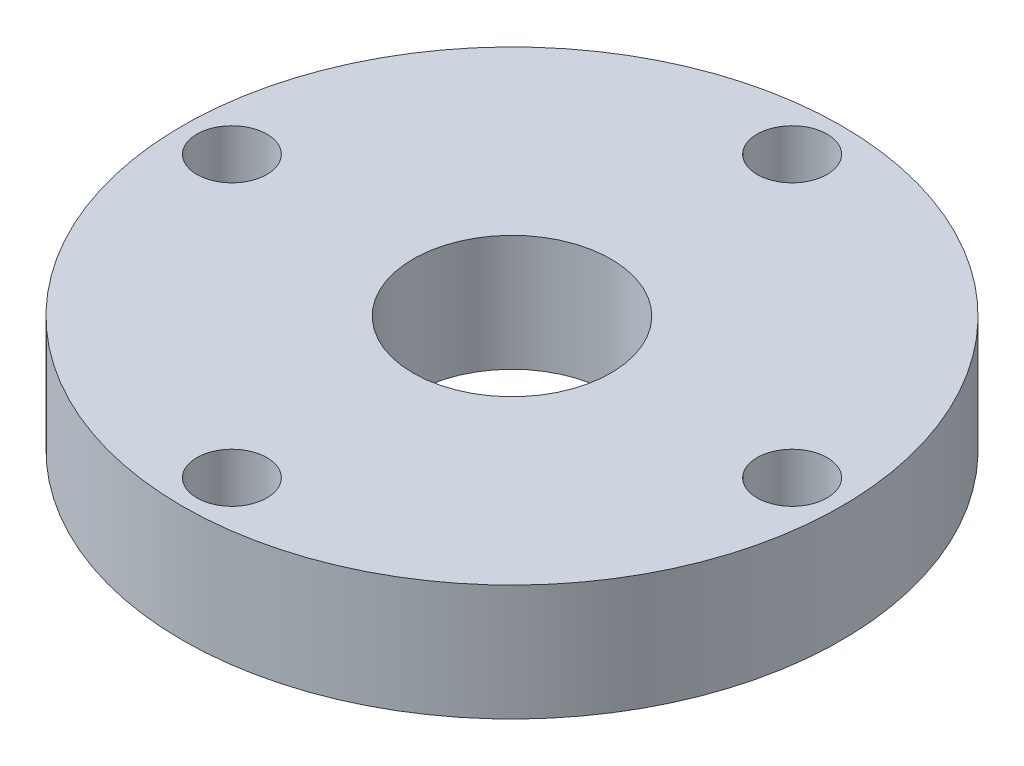
ISO-10303-21;
HEADER;
FILE_DESCRIPTION(('STEP AP214'),'2;1');
FILE_NAME('part.step','',(''),(''),'','','');
FILE_SCHEMA(('AUTOMOTIVE_DESIGN { 1 0 10303 214 1 1 1 1 }'));
ENDSEC;
DATA;
#1=APPLICATION_CONTEXT('core data for automotive mechanical design processes');
#2=APPLICATION_PROTOCOL_DEFINITION('international standard','automotive_design',2000,#1);
#3=PRODUCT_CONTEXT('',#1,'mechanical');
#4=PRODUCT('Part','Part','',(#3));
#5=PRODUCT_RELATED_PRODUCT_CATEGORY('part','',(#4));
#6=PRODUCT_DEFINITION_FORMATION('','',#4);
#7=PRODUCT_DEFINITION_CONTEXT('part definition',#1,'design');
#8=PRODUCT_DEFINITION('design','',#6,#7);
#9=PRODUCT_DEFINITION_SHAPE('','',#8);
#10=(LENGTH_UNIT() NAMED_UNIT(*) SI_UNIT(.MILLI.,.METRE.));
#11=(NAMED_UNIT(*) PLANE_ANGLE_UNIT() SI_UNIT($,.RADIAN.));
#12=(NAMED_UNIT(*) SI_UNIT($,.STERADIAN.) SOLID_ANGLE_UNIT());
#13=UNCERTAINTY_MEASURE_WITH_UNIT(LENGTH_MEASURE(1.E-05),#10,'distance_accuracy_value','');
#14=(GEOMETRIC_REPRESENTATION_CONTEXT(3) GLOBAL_UNCERTAINTY_ASSIGNED_CONTEXT((#13)) GLOBAL_UNIT_ASSIGNED_CONTEXT((#10,
#11,#12)) REPRESENTATION_CONTEXT('',''));
#15=CARTESIAN_POINT('',(0.,0.,0.));
#16=DIRECTION('',(0.,0.,1.));
#17=DIRECTION('',(1.,0.,0.));
#18=AXIS2_PLACEMENT_3D('',#15,#16,#17);
#19=CARTESIAN_POINT('',(0.,-115.824,-53.975));
#20=DIRECTION('',(0.,1.,0.));
#21=DIRECTION('',(0.,0.,1.));
#22=AXIS2_PLACEMENT_3D('',#19,#20,#21);
#23=CYLINDRICAL_SURFACE('',#22,4.3688);
#24=CARTESIAN_POINT('',(0.,-11.176,-53.975));
#25=DIRECTION('',(0.,1.,0.));
#26=DIRECTION('',(0.,0.,1.));
#27=AXIS2_PLACEMENT_3D('',#24,#25,#26);
#28=CIRCLE('',#27,4.3688);
#29=CARTESIAN_POINT('',(0.,-11.176,-49.6062));
#30=VERTEX_POINT('',#29);
#31=EDGE_CURVE('E71',#30,#30,#28,.T.);
#32=ORIENTED_EDGE('',*,*,#31,.F.);
#33=EDGE_LOOP('',(#32));
#34=FACE_BOUND('',#33,.T.);
#35=CARTESIAN_POINT('',(0.,1.524,-53.975));
#36=DIRECTION('',(0.,1.,0.));
#37=DIRECTION('',(0.,0.,1.));
#38=AXIS2_PLACEMENT_3D('',#35,#36,#37);
#39=CIRCLE('',#38,4.3688);
#40=CARTESIAN_POINT('',(0.,1.524,-49.6062));
#41=VERTEX_POINT('',#40);
#42=EDGE_CURVE('E45',#41,#41,#39,.F.);
#43=ORIENTED_EDGE('',*,*,#42,.F.);
#44=EDGE_LOOP('',(#43));
#45=FACE_BOUND('',#44,.T.);
#46=ADVANCED_FACE('F41',(#34,#45),#23,.F.);
#47=CARTESIAN_POINT('',(53.975,-115.824,0.));
#48=DIRECTION('',(0.,1.,0.));
#49=DIRECTION('',(0.,0.,1.));
#50=AXIS2_PLACEMENT_3D('',#47,#48,#49);
#51=CYLINDRICAL_SURFACE('',#50,4.3688);
#52=CARTESIAN_POINT('',(53.975,-11.176,0.));
#53=DIRECTION('',(0.,1.,0.));
#54=DIRECTION('',(0.,0.,1.));
#55=AXIS2_PLACEMENT_3D('',#52,#53,#54);
#56=CIRCLE('',#55,4.3688);
#57=CARTESIAN_POINT('',(53.975,-11.176,4.3688));
#58=VERTEX_POINT('',#57);
#59=EDGE_CURVE('E75',#58,#58,#56,.T.);
#60=ORIENTED_EDGE('',*,*,#59,.F.);
#61=EDGE_LOOP('',(#60));
#62=FACE_BOUND('',#61,.T.);
#63=CARTESIAN_POINT('',(53.975,1.524,0.));
#64=DIRECTION('',(0.,1.,0.));
#65=DIRECTION('',(0.,0.,1.));
#66=AXIS2_PLACEMENT_3D('',#63,#64,#65);
#67=CIRCLE('',#66,4.3688);
#68=CARTESIAN_POINT('',(53.975,1.524,4.3688));
#69=VERTEX_POINT('',#68);
#70=EDGE_CURVE('E65',#69,#69,#67,.F.);
#71=ORIENTED_EDGE('',*,*,#70,.F.);
#72=EDGE_LOOP('',(#71));
#73=FACE_BOUND('',#72,.T.);
#74=ADVANCED_FACE('F119',(#62,#73),#51,.F.);
#75=CARTESIAN_POINT('',(0.,-115.824,53.975));
#76=DIRECTION('',(0.,1.,0.));
#77=DIRECTION('',(0.,0.,1.));
#78=AXIS2_PLACEMENT_3D('',#75,#76,#77);
#79=CYLINDRICAL_SURFACE('',#78,4.3688);
#80=CARTESIAN_POINT('',(0.,-11.176,53.975));
#81=DIRECTION('',(0.,1.,0.));
#82=DIRECTION('',(0.,0.,1.));
#83=AXIS2_PLACEMENT_3D('',#80,#81,#82);
#84=CIRCLE('',#83,4.3688);
#85=CARTESIAN_POINT('',(0.,-11.176,58.3438));
#86=VERTEX_POINT('',#85);
#87=EDGE_CURVE('E80',#86,#86,#84,.T.);
#88=ORIENTED_EDGE('',*,*,#87,.F.);
#89=EDGE_LOOP('',(#88));
#90=FACE_BOUND('',#89,.T.);
#91=CARTESIAN_POINT('',(0.,1.524,53.975));
#92=DIRECTION('',(0.,1.,0.));
#93=DIRECTION('',(0.,0.,1.));
#94=AXIS2_PLACEMENT_3D('',#91,#92,#93);
#95=CIRCLE('',#94,4.3688);
#96=CARTESIAN_POINT('',(0.,1.524,58.3438));
#97=VERTEX_POINT('',#96);
#98=EDGE_CURVE('E63',#97,#97,#95,.F.);
#99=ORIENTED_EDGE('',*,*,#98,.F.);
#100=EDGE_LOOP('',(#99));
#101=FACE_BOUND('',#100,.T.);
#102=ADVANCED_FACE('F125',(#90,#101),#79,.F.);
#103=CARTESIAN_POINT('',(-53.975,-115.824,0.));
#104=DIRECTION('',(0.,1.,0.));
#105=DIRECTION('',(0.,0.,1.));
#106=AXIS2_PLACEMENT_3D('',#103,#104,#105);
#107=CYLINDRICAL_SURFACE('',#106,4.3688);
#108=CARTESIAN_POINT('',(-53.975,-11.176,0.));
#109=DIRECTION('',(0.,1.,0.));
#110=DIRECTION('',(0.,0.,1.));
#111=AXIS2_PLACEMENT_3D('',#108,#109,#110);
#112=CIRCLE('',#111,4.3688);
#113=CARTESIAN_POINT('',(-53.975,-11.176,4.3688));
#114=VERTEX_POINT('',#113);
#115=EDGE_CURVE('E61',#114,#114,#112,.T.);
#116=ORIENTED_EDGE('',*,*,#115,.F.);
#117=EDGE_LOOP('',(#116));
#118=FACE_BOUND('',#117,.T.);
#119=CARTESIAN_POINT('',(-53.975,1.524,0.));
#120=DIRECTION('',(0.,1.,0.));
#121=DIRECTION('',(0.,0.,1.));
#122=AXIS2_PLACEMENT_3D('',#119,#120,#121);
#123=CIRCLE('',#122,4.3688);
#124=CARTESIAN_POINT('',(-53.975,1.524,4.3688));
#125=VERTEX_POINT('',#124);
#126=EDGE_CURVE('E58',#125,#125,#123,.F.);
#127=ORIENTED_EDGE('',*,*,#126,.F.);
#128=EDGE_LOOP('',(#127));
#129=FACE_BOUND('',#128,.T.);
#130=ADVANCED_FACE('F116',(#118,#129),#107,.F.);
#131=CARTESIAN_POINT('',(0.,-11.176,0.));
#132=DIRECTION('',(0.,1.,0.));
#133=DIRECTION('',(0.,0.,1.));
#134=AXIS2_PLACEMENT_3D('',#131,#132,#133);
#135=PLANE('',#134);
#136=ORIENTED_EDGE('',*,*,#87,.T.);
#137=EDGE_LOOP('',(#136));
#138=FACE_BOUND('',#137,.T.);
#139=ORIENTED_EDGE('',*,*,#59,.T.);
#140=EDGE_LOOP('',(#139));
#141=FACE_BOUND('',#140,.T.);
#142=ORIENTED_EDGE('',*,*,#31,.T.);
#143=EDGE_LOOP('',(#142));
#144=FACE_BOUND('',#143,.T.);
#145=ORIENTED_EDGE('',*,*,#115,.T.);
#146=EDGE_LOOP('',(#145));
#147=FACE_BOUND('',#146,.T.);
#148=CARTESIAN_POINT('',(0.,-11.176,0.));
#149=DIRECTION('',(0.,1.,0.));
#150=DIRECTION('',(0.,0.,1.));
#151=AXIS2_PLACEMENT_3D('',#148,#149,#150);
#152=CIRCLE('',#151,19.05);
#153=CARTESIAN_POINT('',(0.,-11.176,19.05));
#154=VERTEX_POINT('',#153);
#155=EDGE_CURVE('E54',#154,#154,#152,.T.);
#156=ORIENTED_EDGE('',*,*,#155,.T.);
#157=EDGE_LOOP('',(#156));
#158=FACE_BOUND('',#157,.T.);
#159=CARTESIAN_POINT('',(0.,-11.176,0.));
#160=DIRECTION('',(0.,-1.,0.));
#161=DIRECTION('',(0.,0.,-1.));
#162=AXIS2_PLACEMENT_3D('',#159,#160,#161);
#163=CIRCLE('',#162,63.5);
#164=CARTESIAN_POINT('',(0.,-11.176,-63.5));
#165=VERTEX_POINT('',#164);
#166=EDGE_CURVE('E10',#165,#165,#163,.T.);
#167=ORIENTED_EDGE('',*,*,#166,.T.);
#168=EDGE_LOOP('',(#167));
#169=FACE_BOUND('',#168,.T.);
#170=ADVANCED_FACE('F43',(#138,#141,#144,#147,#158,#169),#135,.F.);
#171=CARTESIAN_POINT('',(0.,-36.576,0.));
#172=DIRECTION('',(0.,-1.,0.));
#173=DIRECTION('',(0.,0.,-1.));
#174=AXIS2_PLACEMENT_3D('',#171,#172,#173);
#175=CYLINDRICAL_SURFACE('',#174,63.5);
#176=ORIENTED_EDGE('',*,*,#166,.F.);
#177=EDGE_LOOP('',(#176));
#178=FACE_BOUND('',#177,.T.);
#179=CARTESIAN_POINT('',(0.,11.176,0.));
#180=DIRECTION('',(0.,-1.,0.));
#181=DIRECTION('',(0.,0.,-1.));
#182=AXIS2_PLACEMENT_3D('',#179,#180,#181);
#183=CIRCLE('',#182,63.5);
#184=CARTESIAN_POINT('',(0.,11.176,-63.5));
#185=VERTEX_POINT('',#184);
#186=EDGE_CURVE('E49',#185,#185,#183,.T.);
#187=ORIENTED_EDGE('',*,*,#186,.T.);
#188=EDGE_LOOP('',(#187));
#189=FACE_BOUND('',#188,.T.);
#190=ADVANCED_FACE('F105',(#178,#189),#175,.T.);
#191=CARTESIAN_POINT('',(-63.5,11.176,0.));
#192=DIRECTION('',(0.,-1.,0.));
#193=DIRECTION('',(0.,0.,-1.));
#194=AXIS2_PLACEMENT_3D('',#191,#192,#193);
#195=PLANE('',#194);
#196=CARTESIAN_POINT('',(0.,11.176,53.975));
#197=DIRECTION('',(0.,1.,0.));
#198=DIRECTION('',(0.,0.,1.));
#199=AXIS2_PLACEMENT_3D('',#196,#197,#198);
#200=CIRCLE('',#199,6.7437);
#201=CARTESIAN_POINT('',(0.,11.176,60.7187));
#202=VERTEX_POINT('',#201);
#203=EDGE_CURVE('E286',#202,#202,#200,.T.);
#204=ORIENTED_EDGE('',*,*,#203,.F.);
#205=EDGE_LOOP('',(#204));
#206=FACE_BOUND('',#205,.T.);
#207=CARTESIAN_POINT('',(53.975,11.176,0.));
#208=DIRECTION('',(0.,1.,0.));
#209=DIRECTION('',(0.,0.,1.));
#210=AXIS2_PLACEMENT_3D('',#207,#208,#209);
#211=CIRCLE('',#210,6.7437);
#212=CARTESIAN_POINT('',(53.975,11.176,6.7437));
#213=VERTEX_POINT('',#212);
#214=EDGE_CURVE('E281',#213,#213,#211,.T.);
#215=ORIENTED_EDGE('',*,*,#214,.F.);
#216=EDGE_LOOP('',(#215));
#217=FACE_BOUND('',#216,.T.);
#218=CARTESIAN_POINT('',(0.,11.176,-53.975));
#219=DIRECTION('',(0.,1.,0.));
#220=DIRECTION('',(0.,0.,1.));
#221=AXIS2_PLACEMENT_3D('',#218,#219,#220);
#222=CIRCLE('',#221,6.7437);
#223=CARTESIAN_POINT('',(0.,11.176,-47.2313));
#224=VERTEX_POINT('',#223);
#225=EDGE_CURVE('E277',#224,#224,#222,.T.);
#226=ORIENTED_EDGE('',*,*,#225,.F.);
#227=EDGE_LOOP('',(#226));
#228=FACE_BOUND('',#227,.T.);
#229=CARTESIAN_POINT('',(-53.975,11.176,0.));
#230=DIRECTION('',(0.,1.,0.));
#231=DIRECTION('',(0.,0.,1.));
#232=AXIS2_PLACEMENT_3D('',#229,#230,#231);
#233=CIRCLE('',#232,6.7437);
#234=CARTESIAN_POINT('',(-53.975,11.176,6.7437));
#235=VERTEX_POINT('',#234);
#236=EDGE_CURVE('E88',#235,#235,#233,.T.);
#237=ORIENTED_EDGE('',*,*,#236,.F.);
#238=EDGE_LOOP('',(#237));
#239=FACE_BOUND('',#238,.T.);
#240=CARTESIAN_POINT('',(0.,11.176,0.));
#241=DIRECTION('',(0.,1.,0.));
#242=DIRECTION('',(0.,0.,1.));
#243=AXIS2_PLACEMENT_3D('',#240,#241,#242);
#244=CIRCLE('',#243,19.05);
#245=CARTESIAN_POINT('',(0.,11.176,19.05));
#246=VERTEX_POINT('',#245);
#247=EDGE_CURVE('E95',#246,#246,#244,.T.);
#248=ORIENTED_EDGE('',*,*,#247,.F.);
#249=EDGE_LOOP('',(#248));
#250=FACE_BOUND('',#249,.T.);
#251=ORIENTED_EDGE('',*,*,#186,.F.);
#252=EDGE_LOOP('',(#251));
#253=FACE_BOUND('',#252,.T.);
#254=ADVANCED_FACE('F102',(#206,#217,#228,#239,#250,#253),#195,.F.);
#255=CARTESIAN_POINT('',(0.,-11.176,0.));
#256=DIRECTION('',(0.,1.,0.));
#257=DIRECTION('',(0.,0.,1.));
#258=AXIS2_PLACEMENT_3D('',#255,#256,#257);
#259=CYLINDRICAL_SURFACE('',#258,19.05);
#260=ORIENTED_EDGE('',*,*,#155,.F.);
#261=EDGE_LOOP('',(#260));
#262=FACE_BOUND('',#261,.T.);
#263=ORIENTED_EDGE('',*,*,#247,.T.);
#264=EDGE_LOOP('',(#263));
#265=FACE_BOUND('',#264,.T.);
#266=ADVANCED_FACE('F100',(#262,#265),#259,.F.);
#267=CARTESIAN_POINT('',(-53.975,1.524,0.));
#268=DIRECTION('',(0.,1.,0.));
#269=DIRECTION('',(0.,0.,1.));
#270=AXIS2_PLACEMENT_3D('',#267,#268,#269);
#271=PLANE('',#270);
#272=CARTESIAN_POINT('',(-53.975,1.524,0.));
#273=DIRECTION('',(0.,1.,0.));
#274=DIRECTION('',(0.,0.,1.));
#275=AXIS2_PLACEMENT_3D('',#272,#273,#274);
#276=CIRCLE('',#275,6.7437);
#277=CARTESIAN_POINT('',(-53.975,1.524,6.7437));
#278=VERTEX_POINT('',#277);
#279=EDGE_CURVE('E62',#278,#278,#276,.T.);
#280=ORIENTED_EDGE('',*,*,#279,.T.);
#281=EDGE_LOOP('',(#280));
#282=FACE_BOUND('',#281,.T.);
#283=ORIENTED_EDGE('',*,*,#126,.T.);
#284=EDGE_LOOP('',(#283));
#285=FACE_BOUND('',#284,.T.);
#286=ADVANCED_FACE('F131',(#282,#285),#271,.T.);
#287=CARTESIAN_POINT('',(-53.975,1.524,0.));
#288=DIRECTION('',(0.,1.,0.));
#289=DIRECTION('',(0.,0.,1.));
#290=AXIS2_PLACEMENT_3D('',#287,#288,#289);
#291=CYLINDRICAL_SURFACE('',#290,6.7437);
#292=ORIENTED_EDGE('',*,*,#279,.F.);
#293=EDGE_LOOP('',(#292));
#294=FACE_BOUND('',#293,.T.);
#295=ORIENTED_EDGE('',*,*,#236,.T.);
#296=EDGE_LOOP('',(#295));
#297=FACE_BOUND('',#296,.T.);
#298=ADVANCED_FACE('F134',(#294,#297),#291,.F.);
#299=CARTESIAN_POINT('',(0.,1.524,53.975));
#300=DIRECTION('',(0.,1.,0.));
#301=DIRECTION('',(0.,0.,1.));
#302=AXIS2_PLACEMENT_3D('',#299,#300,#301);
#303=PLANE('',#302);
#304=CARTESIAN_POINT('',(0.,1.524,53.975));
#305=DIRECTION('',(0.,1.,0.));
#306=DIRECTION('',(0.,0.,1.));
#307=AXIS2_PLACEMENT_3D('',#304,#305,#306);
#308=CIRCLE('',#307,6.7437);
#309=CARTESIAN_POINT('',(0.,1.524,60.7187));
#310=VERTEX_POINT('',#309);
#311=EDGE_CURVE('E66',#310,#310,#308,.T.);
#312=ORIENTED_EDGE('',*,*,#311,.T.);
#313=EDGE_LOOP('',(#312));
#314=FACE_BOUND('',#313,.T.);
#315=ORIENTED_EDGE('',*,*,#98,.T.);
#316=EDGE_LOOP('',(#315));
#317=FACE_BOUND('',#316,.T.);
#318=ADVANCED_FACE('F138',(#314,#317),#303,.T.);
#319=CARTESIAN_POINT('',(0.,1.524,53.975));
#320=DIRECTION('',(0.,1.,0.));
#321=DIRECTION('',(0.,0.,1.));
#322=AXIS2_PLACEMENT_3D('',#319,#320,#321);
#323=CYLINDRICAL_SURFACE('',#322,6.7437);
#324=ORIENTED_EDGE('',*,*,#311,.F.);
#325=EDGE_LOOP('',(#324));
#326=FACE_BOUND('',#325,.T.);
#327=ORIENTED_EDGE('',*,*,#203,.T.);
#328=EDGE_LOOP('',(#327));
#329=FACE_BOUND('',#328,.T.);
#330=ADVANCED_FACE('F189',(#326,#329),#323,.F.);
#331=CARTESIAN_POINT('',(53.975,1.524,0.));
#332=DIRECTION('',(0.,1.,0.));
#333=DIRECTION('',(0.,0.,1.));
#334=AXIS2_PLACEMENT_3D('',#331,#332,#333);
#335=PLANE('',#334);
#336=CARTESIAN_POINT('',(53.975,1.524,0.));
#337=DIRECTION('',(0.,1.,0.));
#338=DIRECTION('',(0.,0.,1.));
#339=AXIS2_PLACEMENT_3D('',#336,#337,#338);
#340=CIRCLE('',#339,6.7437);
#341=CARTESIAN_POINT('',(53.975,1.524,6.7437));
#342=VERTEX_POINT('',#341);
#343=EDGE_CURVE('E279',#342,#342,#340,.T.);
#344=ORIENTED_EDGE('',*,*,#343,.T.);
#345=EDGE_LOOP('',(#344));
#346=FACE_BOUND('',#345,.T.);
#347=ORIENTED_EDGE('',*,*,#70,.T.);
#348=EDGE_LOOP('',(#347));
#349=FACE_BOUND('',#348,.T.);
#350=ADVANCED_FACE('F199',(#346,#349),#335,.T.);
#351=CARTESIAN_POINT('',(53.975,1.524,0.));
#352=DIRECTION('',(0.,1.,0.));
#353=DIRECTION('',(0.,0.,1.));
#354=AXIS2_PLACEMENT_3D('',#351,#352,#353);
#355=CYLINDRICAL_SURFACE('',#354,6.7437);
#356=ORIENTED_EDGE('',*,*,#343,.F.);
#357=EDGE_LOOP('',(#356));
#358=FACE_BOUND('',#357,.T.);
#359=ORIENTED_EDGE('',*,*,#214,.T.);
#360=EDGE_LOOP('',(#359));
#361=FACE_BOUND('',#360,.T.);
#362=ADVANCED_FACE('F208',(#358,#361),#355,.F.);
#363=CARTESIAN_POINT('',(0.,1.524,-53.975));
#364=DIRECTION('',(0.,1.,0.));
#365=DIRECTION('',(0.,0.,1.));
#366=AXIS2_PLACEMENT_3D('',#363,#364,#365);
#367=PLANE('',#366);
#368=CARTESIAN_POINT('',(0.,1.524,-53.975));
#369=DIRECTION('',(0.,1.,0.));
#370=DIRECTION('',(0.,0.,1.));
#371=AXIS2_PLACEMENT_3D('',#368,#369,#370);
#372=CIRCLE('',#371,6.7437);
#373=CARTESIAN_POINT('',(0.,1.524,-47.2313));
#374=VERTEX_POINT('',#373);
#375=EDGE_CURVE('E83',#374,#374,#372,.T.);
#376=ORIENTED_EDGE('',*,*,#375,.T.);
#377=EDGE_LOOP('',(#376));
#378=FACE_BOUND('',#377,.T.);
#379=ORIENTED_EDGE('',*,*,#42,.T.);
#380=EDGE_LOOP('',(#379));
#381=FACE_BOUND('',#380,.T.);
#382=ADVANCED_FACE('F217',(#378,#381),#367,.T.);
#383=CARTESIAN_POINT('',(0.,1.524,-53.975));
#384=DIRECTION('',(0.,1.,0.));
#385=DIRECTION('',(0.,0.,1.));
#386=AXIS2_PLACEMENT_3D('',#383,#384,#385);
#387=CYLINDRICAL_SURFACE('',#386,6.7437);
#388=ORIENTED_EDGE('',*,*,#375,.F.);
#389=EDGE_LOOP('',(#388));
#390=FACE_BOUND('',#389,.T.);
#391=ORIENTED_EDGE('',*,*,#225,.T.);
#392=EDGE_LOOP('',(#391));
#393=FACE_BOUND('',#392,.T.);
#394=ADVANCED_FACE('F226',(#390,#393),#387,.F.);
#395=CLOSED_SHELL('',(#46,#74,#102,#130,#170,#190,#254,#266,#286,#298,#318,#330,#350,#362,#382,#394));
#396=MANIFOLD_SOLID_BREP('B2',#395);
#397=ADVANCED_BREP_SHAPE_REPRESENTATION('',(#18,#396),#14);
#398=SHAPE_DEFINITION_REPRESENTATION(#9,#397);
ENDSEC;
END-ISO-10303-21;
